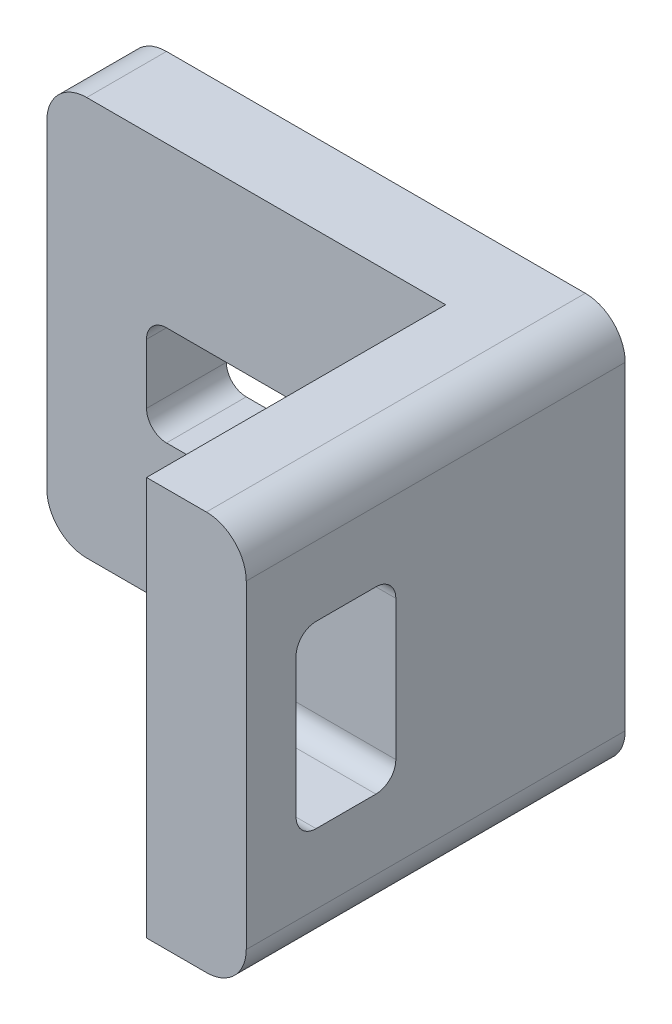
ISO-10303-21;
HEADER;
FILE_DESCRIPTION(('STEP AP214'),'2;1');
FILE_NAME('part.step','',(''),(''),'','','');
FILE_SCHEMA(('AUTOMOTIVE_DESIGN { 1 0 10303 214 1 1 1 1 }'));
ENDSEC;
DATA;
#1=APPLICATION_CONTEXT('core data for automotive mechanical design processes');
#2=APPLICATION_PROTOCOL_DEFINITION('international standard','automotive_design',2000,#1);
#3=PRODUCT_CONTEXT('',#1,'mechanical');
#4=PRODUCT('Part','Part','',(#3));
#5=PRODUCT_RELATED_PRODUCT_CATEGORY('part','',(#4));
#6=PRODUCT_DEFINITION_FORMATION('','',#4);
#7=PRODUCT_DEFINITION_CONTEXT('part definition',#1,'design');
#8=PRODUCT_DEFINITION('design','',#6,#7);
#9=PRODUCT_DEFINITION_SHAPE('','',#8);
#10=(LENGTH_UNIT() NAMED_UNIT(*) SI_UNIT(.MILLI.,.METRE.));
#11=(NAMED_UNIT(*) PLANE_ANGLE_UNIT() SI_UNIT($,.RADIAN.));
#12=(NAMED_UNIT(*) SI_UNIT($,.STERADIAN.) SOLID_ANGLE_UNIT());
#13=UNCERTAINTY_MEASURE_WITH_UNIT(LENGTH_MEASURE(1.E-05),#10,'distance_accuracy_value','');
#14=(GEOMETRIC_REPRESENTATION_CONTEXT(3) GLOBAL_UNCERTAINTY_ASSIGNED_CONTEXT((#13)) GLOBAL_UNIT_ASSIGNED_CONTEXT((#10,
#11,#12)) REPRESENTATION_CONTEXT('',''));
#15=CARTESIAN_POINT('',(0.,0.,0.));
#16=DIRECTION('',(0.,0.,1.));
#17=DIRECTION('',(1.,0.,0.));
#18=AXIS2_PLACEMENT_3D('',#15,#16,#17);
#19=CARTESIAN_POINT('',(9.72672672672673,6.70870870870871,4.));
#20=DIRECTION('',(0.,0.,-1.));
#21=DIRECTION('',(-1.,0.,0.));
#22=AXIS2_PLACEMENT_3D('',#19,#20,#21);
#23=PLANE('',#22);
#24=DIRECTION('',(0.,-1.,0.));
#25=VECTOR('',#24,1.);
#26=CARTESIAN_POINT('',(-8.27327327327327,-0.291291291291291,4.));
#27=LINE('',#26,#25);
#28=CARTESIAN_POINT('',(-8.27327327327327,-0.291291291291291,4.));
#29=VERTEX_POINT('',#28);
#30=CARTESIAN_POINT('',(-8.27327327327327,-3.29129129129129,4.));
#31=VERTEX_POINT('',#30);
#32=EDGE_CURVE('E277',#29,#31,#27,.T.);
#33=ORIENTED_EDGE('',*,*,#32,.F.);
#34=CARTESIAN_POINT('',(-7.27327327327327,-0.291291291291291,4.));
#35=DIRECTION('',(0.,0.,1.));
#36=DIRECTION('',(-1.,0.,0.));
#37=AXIS2_PLACEMENT_3D('',#34,#35,#36);
#38=CIRCLE('',#37,1.);
#39=CARTESIAN_POINT('',(-7.27327327327327,0.708708708708709,4.));
#40=VERTEX_POINT('',#39);
#41=EDGE_CURVE('E275',#40,#29,#38,.T.);
#42=ORIENTED_EDGE('',*,*,#41,.F.);
#43=DIRECTION('',(-1.,0.,0.));
#44=VECTOR('',#43,1.);
#45=CARTESIAN_POINT('',(-7.27327327327327,0.708708708708709,4.));
#46=LINE('',#45,#44);
#47=CARTESIAN_POINT('',(-0.273273273273275,0.708708708708709,4.));
#48=VERTEX_POINT('',#47);
#49=EDGE_CURVE('E295',#48,#40,#46,.T.);
#50=ORIENTED_EDGE('',*,*,#49,.F.);
#51=CARTESIAN_POINT('',(-0.273273273273275,-0.291291291291291,4.));
#52=DIRECTION('',(0.,0.,1.));
#53=DIRECTION('',(1.,0.,0.));
#54=AXIS2_PLACEMENT_3D('',#51,#52,#53);
#55=CIRCLE('',#54,1.);
#56=CARTESIAN_POINT('',(0.726726726726726,-0.291291291291291,4.));
#57=VERTEX_POINT('',#56);
#58=EDGE_CURVE('E292',#57,#48,#55,.T.);
#59=ORIENTED_EDGE('',*,*,#58,.F.);
#60=DIRECTION('',(0.,1.,0.));
#61=VECTOR('',#60,1.);
#62=CARTESIAN_POINT('',(0.726726726726726,-0.291291291291291,4.));
#63=LINE('',#62,#61);
#64=CARTESIAN_POINT('',(0.726726726726727,-3.29129129129129,4.));
#65=VERTEX_POINT('',#64);
#66=EDGE_CURVE('E289',#65,#57,#63,.T.);
#67=ORIENTED_EDGE('',*,*,#66,.F.);
#68=CARTESIAN_POINT('',(-0.273273273273274,-3.29129129129129,4.));
#69=DIRECTION('',(0.,0.,1.));
#70=DIRECTION('',(1.,0.,0.));
#71=AXIS2_PLACEMENT_3D('',#68,#69,#70);
#72=CIRCLE('',#71,1.);
#73=CARTESIAN_POINT('',(-0.273273273273274,-4.29129129129129,4.));
#74=VERTEX_POINT('',#73);
#75=EDGE_CURVE('E286',#74,#65,#72,.T.);
#76=ORIENTED_EDGE('',*,*,#75,.F.);
#77=DIRECTION('',(1.,0.,0.));
#78=VECTOR('',#77,1.);
#79=CARTESIAN_POINT('',(-7.27327327327327,-4.29129129129129,4.));
#80=LINE('',#79,#78);
#81=CARTESIAN_POINT('',(-7.27327327327327,-4.29129129129129,4.));
#82=VERTEX_POINT('',#81);
#83=EDGE_CURVE('E283',#82,#74,#80,.T.);
#84=ORIENTED_EDGE('',*,*,#83,.F.);
#85=CARTESIAN_POINT('',(-7.27327327327327,-3.29129129129129,4.));
#86=DIRECTION('',(0.,0.,1.));
#87=DIRECTION('',(1.,0.,0.));
#88=AXIS2_PLACEMENT_3D('',#85,#86,#87);
#89=CIRCLE('',#88,1.);
#90=EDGE_CURVE('E280',#31,#82,#89,.T.);
#91=ORIENTED_EDGE('',*,*,#90,.F.);
#92=EDGE_LOOP('',(#33,#42,#50,#59,#67,#76,#84,#91));
#93=FACE_BOUND('',#92,.T.);
#94=DIRECTION('',(0.,-1.,0.));
#95=VECTOR('',#94,1.);
#96=CARTESIAN_POINT('',(6.72672672672674,8.70870870870871,4.));
#97=LINE('',#96,#95);
#98=CARTESIAN_POINT('',(6.72672672672674,8.70870870870871,4.));
#99=VERTEX_POINT('',#98);
#100=CARTESIAN_POINT('',(6.72672672672674,-11.2912912912913,4.));
#101=VERTEX_POINT('',#100);
#102=EDGE_CURVE('E301',#99,#101,#97,.T.);
#103=ORIENTED_EDGE('',*,*,#102,.F.);
#104=DIRECTION('',(-1.,0.,0.));
#105=VECTOR('',#104,1.);
#106=CARTESIAN_POINT('',(-11.2732732732733,8.70870870870871,4.));
#107=LINE('',#106,#105);
#108=CARTESIAN_POINT('',(-11.2732732732733,8.70870870870871,4.));
#109=VERTEX_POINT('',#108);
#110=EDGE_CURVE('E342',#99,#109,#107,.T.);
#111=ORIENTED_EDGE('',*,*,#110,.T.);
#112=CARTESIAN_POINT('',(-11.2732732732733,6.70870870870871,4.));
#113=DIRECTION('',(0.,0.,1.));
#114=DIRECTION('',(-1.,0.,0.));
#115=AXIS2_PLACEMENT_3D('',#112,#113,#114);
#116=CIRCLE('',#115,2.);
#117=CARTESIAN_POINT('',(-13.2732732732733,6.7087087087087,4.));
#118=VERTEX_POINT('',#117);
#119=EDGE_CURVE('E344',#109,#118,#116,.T.);
#120=ORIENTED_EDGE('',*,*,#119,.T.);
#121=DIRECTION('',(0.,-1.,0.));
#122=VECTOR('',#121,1.);
#123=CARTESIAN_POINT('',(-13.2732732732733,6.7087087087087,4.));
#124=LINE('',#123,#122);
#125=CARTESIAN_POINT('',(-13.2732732732733,-9.29129129129128,4.));
#126=VERTEX_POINT('',#125);
#127=EDGE_CURVE('E347',#118,#126,#124,.T.);
#128=ORIENTED_EDGE('',*,*,#127,.T.);
#129=CARTESIAN_POINT('',(-11.2732732732733,-9.29129129129129,4.));
#130=DIRECTION('',(0.,0.,1.));
#131=DIRECTION('',(-1.,0.,0.));
#132=AXIS2_PLACEMENT_3D('',#129,#130,#131);
#133=CIRCLE('',#132,2.);
#134=CARTESIAN_POINT('',(-11.2732732732733,-11.2912912912913,4.));
#135=VERTEX_POINT('',#134);
#136=EDGE_CURVE('E349',#126,#135,#133,.T.);
#137=ORIENTED_EDGE('',*,*,#136,.T.);
#138=DIRECTION('',(1.,0.,0.));
#139=VECTOR('',#138,1.);
#140=CARTESIAN_POINT('',(-11.2732732732733,-11.2912912912913,4.));
#141=LINE('',#140,#139);
#142=EDGE_CURVE('E351',#135,#101,#141,.T.);
#143=ORIENTED_EDGE('',*,*,#142,.T.);
#144=EDGE_LOOP('',(#103,#111,#120,#128,#137,#143));
#145=FACE_BOUND('',#144,.T.);
#146=ADVANCED_FACE('F33',(#93,#145),#23,.F.);
#147=CARTESIAN_POINT('',(9.72672672672673,6.70870870870871,4.));
#148=DIRECTION('',(0.,0.,-1.));
#149=DIRECTION('',(-1.,0.,0.));
#150=AXIS2_PLACEMENT_3D('',#147,#148,#149);
#151=CYLINDRICAL_SURFACE('',#150,2.);
#152=CARTESIAN_POINT('',(9.72672672672673,6.70870870870871,0.));
#153=DIRECTION('',(0.,0.,1.));
#154=DIRECTION('',(-1.,0.,0.));
#155=AXIS2_PLACEMENT_3D('',#152,#153,#154);
#156=CIRCLE('',#155,2.);
#157=CARTESIAN_POINT('',(11.7267267267267,6.70870870870871,0.));
#158=VERTEX_POINT('',#157);
#159=CARTESIAN_POINT('',(9.72672672672673,8.70870870870871,0.));
#160=VERTEX_POINT('',#159);
#161=EDGE_CURVE('E341',#158,#160,#156,.T.);
#162=ORIENTED_EDGE('',*,*,#161,.T.);
#163=DIRECTION('',(0.,0.,-1.));
#164=VECTOR('',#163,1.);
#165=CARTESIAN_POINT('',(9.72672672672673,8.70870870870871,4.));
#166=LINE('',#165,#164);
#167=CARTESIAN_POINT('',(9.72672672672673,8.70870870870871,19.));
#168=VERTEX_POINT('',#167);
#169=EDGE_CURVE('E389',#168,#160,#166,.T.);
#170=ORIENTED_EDGE('',*,*,#169,.F.);
#171=CARTESIAN_POINT('',(9.72672672672673,6.70870870870871,19.));
#172=DIRECTION('',(0.,0.,1.));
#173=DIRECTION('',(-1.,0.,0.));
#174=AXIS2_PLACEMENT_3D('',#171,#172,#173);
#175=CIRCLE('',#174,2.);
#176=CARTESIAN_POINT('',(11.7267267267267,6.70870870870871,19.));
#177=VERTEX_POINT('',#176);
#178=EDGE_CURVE('E328',#177,#168,#175,.T.);
#179=ORIENTED_EDGE('',*,*,#178,.F.);
#180=DIRECTION('',(0.,0.,-1.));
#181=VECTOR('',#180,1.);
#182=CARTESIAN_POINT('',(11.7267267267267,6.70870870870871,4.));
#183=LINE('',#182,#181);
#184=EDGE_CURVE('E353',#177,#158,#183,.T.);
#185=ORIENTED_EDGE('',*,*,#184,.T.);
#186=EDGE_LOOP('',(#162,#170,#179,#185));
#187=FACE_BOUND('',#186,.T.);
#188=ADVANCED_FACE('F35',(#187),#151,.T.);
#189=CARTESIAN_POINT('',(-11.2732732732733,8.70870870870871,4.));
#190=DIRECTION('',(0.,-1.,0.));
#191=DIRECTION('',(0.,0.,-1.));
#192=AXIS2_PLACEMENT_3D('',#189,#190,#191);
#193=PLANE('',#192);
#194=DIRECTION('',(-1.,0.,0.));
#195=VECTOR('',#194,1.);
#196=CARTESIAN_POINT('',(-11.2732732732733,8.70870870870871,0.));
#197=LINE('',#196,#195);
#198=CARTESIAN_POINT('',(-11.2732732732733,8.70870870870871,0.));
#199=VERTEX_POINT('',#198);
#200=EDGE_CURVE('E356',#160,#199,#197,.T.);
#201=ORIENTED_EDGE('',*,*,#200,.T.);
#202=DIRECTION('',(0.,0.,-1.));
#203=VECTOR('',#202,1.);
#204=CARTESIAN_POINT('',(-11.2732732732733,8.70870870870871,4.));
#205=LINE('',#204,#203);
#206=EDGE_CURVE('E386',#109,#199,#205,.T.);
#207=ORIENTED_EDGE('',*,*,#206,.F.);
#208=ORIENTED_EDGE('',*,*,#110,.F.);
#209=DIRECTION('',(0.,0.,-1.));
#210=VECTOR('',#209,1.);
#211=CARTESIAN_POINT('',(6.72672672672674,8.70870870870871,19.));
#212=LINE('',#211,#210);
#213=CARTESIAN_POINT('',(6.72672672672674,8.70870870870871,19.));
#214=VERTEX_POINT('',#213);
#215=EDGE_CURVE('E333',#214,#99,#212,.T.);
#216=ORIENTED_EDGE('',*,*,#215,.F.);
#217=DIRECTION('',(-1.,0.,0.));
#218=VECTOR('',#217,1.);
#219=CARTESIAN_POINT('',(6.72672672672674,8.70870870870871,19.));
#220=LINE('',#219,#218);
#221=EDGE_CURVE('E331',#168,#214,#220,.T.);
#222=ORIENTED_EDGE('',*,*,#221,.F.);
#223=ORIENTED_EDGE('',*,*,#169,.T.);
#224=EDGE_LOOP('',(#201,#207,#208,#216,#222,#223));
#225=FACE_BOUND('',#224,.T.);
#226=ADVANCED_FACE('F461',(#225),#193,.F.);
#227=CARTESIAN_POINT('',(-11.2732732732733,6.70870870870871,4.));
#228=DIRECTION('',(0.,0.,-1.));
#229=DIRECTION('',(-1.,0.,0.));
#230=AXIS2_PLACEMENT_3D('',#227,#228,#229);
#231=CYLINDRICAL_SURFACE('',#230,2.);
#232=CARTESIAN_POINT('',(-11.2732732732733,6.70870870870871,0.));
#233=DIRECTION('',(0.,0.,1.));
#234=DIRECTION('',(-1.,0.,0.));
#235=AXIS2_PLACEMENT_3D('',#232,#233,#234);
#236=CIRCLE('',#235,2.);
#237=CARTESIAN_POINT('',(-13.2732732732733,6.7087087087087,0.));
#238=VERTEX_POINT('',#237);
#239=EDGE_CURVE('E358',#199,#238,#236,.T.);
#240=ORIENTED_EDGE('',*,*,#239,.T.);
#241=DIRECTION('',(0.,0.,-1.));
#242=VECTOR('',#241,1.);
#243=CARTESIAN_POINT('',(-13.2732732732733,6.7087087087087,4.));
#244=LINE('',#243,#242);
#245=EDGE_CURVE('E383',#118,#238,#244,.T.);
#246=ORIENTED_EDGE('',*,*,#245,.F.);
#247=ORIENTED_EDGE('',*,*,#119,.F.);
#248=ORIENTED_EDGE('',*,*,#206,.T.);
#249=EDGE_LOOP('',(#240,#246,#247,#248));
#250=FACE_BOUND('',#249,.T.);
#251=ADVANCED_FACE('F487',(#250),#231,.T.);
#252=CARTESIAN_POINT('',(-13.2732732732733,6.7087087087087,4.));
#253=DIRECTION('',(1.,0.,0.));
#254=DIRECTION('',(0.,0.,-1.));
#255=AXIS2_PLACEMENT_3D('',#252,#253,#254);
#256=PLANE('',#255);
#257=DIRECTION('',(0.,-1.,0.));
#258=VECTOR('',#257,1.);
#259=CARTESIAN_POINT('',(-13.2732732732733,6.7087087087087,0.));
#260=LINE('',#259,#258);
#261=CARTESIAN_POINT('',(-13.2732732732733,-9.29129129129128,0.));
#262=VERTEX_POINT('',#261);
#263=EDGE_CURVE('E360',#238,#262,#260,.T.);
#264=ORIENTED_EDGE('',*,*,#263,.T.);
#265=DIRECTION('',(0.,0.,-1.));
#266=VECTOR('',#265,1.);
#267=CARTESIAN_POINT('',(-13.2732732732733,-9.29129129129128,4.));
#268=LINE('',#267,#266);
#269=EDGE_CURVE('E380',#126,#262,#268,.T.);
#270=ORIENTED_EDGE('',*,*,#269,.F.);
#271=ORIENTED_EDGE('',*,*,#127,.F.);
#272=ORIENTED_EDGE('',*,*,#245,.T.);
#273=EDGE_LOOP('',(#264,#270,#271,#272));
#274=FACE_BOUND('',#273,.T.);
#275=ADVANCED_FACE('F483',(#274),#256,.F.);
#276=CARTESIAN_POINT('',(-11.2732732732733,-9.29129129129129,4.));
#277=DIRECTION('',(0.,0.,-1.));
#278=DIRECTION('',(-1.,0.,0.));
#279=AXIS2_PLACEMENT_3D('',#276,#277,#278);
#280=CYLINDRICAL_SURFACE('',#279,2.);
#281=CARTESIAN_POINT('',(-11.2732732732733,-9.29129129129129,0.));
#282=DIRECTION('',(0.,0.,1.));
#283=DIRECTION('',(-1.,0.,0.));
#284=AXIS2_PLACEMENT_3D('',#281,#282,#283);
#285=CIRCLE('',#284,2.);
#286=CARTESIAN_POINT('',(-11.2732732732733,-11.2912912912913,0.));
#287=VERTEX_POINT('',#286);
#288=EDGE_CURVE('E362',#262,#287,#285,.T.);
#289=ORIENTED_EDGE('',*,*,#288,.T.);
#290=DIRECTION('',(0.,0.,-1.));
#291=VECTOR('',#290,1.);
#292=CARTESIAN_POINT('',(-11.2732732732733,-11.2912912912913,4.));
#293=LINE('',#292,#291);
#294=EDGE_CURVE('E377',#135,#287,#293,.T.);
#295=ORIENTED_EDGE('',*,*,#294,.F.);
#296=ORIENTED_EDGE('',*,*,#136,.F.);
#297=ORIENTED_EDGE('',*,*,#269,.T.);
#298=EDGE_LOOP('',(#289,#295,#296,#297));
#299=FACE_BOUND('',#298,.T.);
#300=ADVANCED_FACE('F479',(#299),#280,.T.);
#301=CARTESIAN_POINT('',(-11.2732732732733,-11.2912912912913,4.));
#302=DIRECTION('',(0.,1.,0.));
#303=DIRECTION('',(0.,0.,1.));
#304=AXIS2_PLACEMENT_3D('',#301,#302,#303);
#305=PLANE('',#304);
#306=DIRECTION('',(1.,0.,0.));
#307=VECTOR('',#306,1.);
#308=CARTESIAN_POINT('',(-11.2732732732733,-11.2912912912913,0.));
#309=LINE('',#308,#307);
#310=CARTESIAN_POINT('',(9.72672672672673,-11.2912912912913,0.));
#311=VERTEX_POINT('',#310);
#312=EDGE_CURVE('E364',#287,#311,#309,.T.);
#313=ORIENTED_EDGE('',*,*,#312,.T.);
#314=DIRECTION('',(0.,0.,-1.));
#315=VECTOR('',#314,1.);
#316=CARTESIAN_POINT('',(9.72672672672673,-11.2912912912913,4.));
#317=LINE('',#316,#315);
#318=CARTESIAN_POINT('',(9.72672672672673,-11.2912912912913,19.));
#319=VERTEX_POINT('',#318);
#320=EDGE_CURVE('E374',#319,#311,#317,.T.);
#321=ORIENTED_EDGE('',*,*,#320,.F.);
#322=DIRECTION('',(1.,0.,0.));
#323=VECTOR('',#322,1.);
#324=CARTESIAN_POINT('',(6.72672672672674,-11.2912912912913,19.));
#325=LINE('',#324,#323);
#326=CARTESIAN_POINT('',(6.72672672672674,-11.2912912912913,19.));
#327=VERTEX_POINT('',#326);
#328=EDGE_CURVE('E319',#327,#319,#325,.T.);
#329=ORIENTED_EDGE('',*,*,#328,.F.);
#330=DIRECTION('',(0.,0.,-1.));
#331=VECTOR('',#330,1.);
#332=CARTESIAN_POINT('',(6.72672672672674,-11.2912912912913,19.));
#333=LINE('',#332,#331);
#334=EDGE_CURVE('E338',#327,#101,#333,.T.);
#335=ORIENTED_EDGE('',*,*,#334,.T.);
#336=ORIENTED_EDGE('',*,*,#142,.F.);
#337=ORIENTED_EDGE('',*,*,#294,.T.);
#338=EDGE_LOOP('',(#313,#321,#329,#335,#336,#337));
#339=FACE_BOUND('',#338,.T.);
#340=ADVANCED_FACE('F475',(#339),#305,.F.);
#341=CARTESIAN_POINT('',(9.72672672672673,-9.29129129129129,4.));
#342=DIRECTION('',(0.,0.,-1.));
#343=DIRECTION('',(-1.,0.,0.));
#344=AXIS2_PLACEMENT_3D('',#341,#342,#343);
#345=CYLINDRICAL_SURFACE('',#344,2.);
#346=CARTESIAN_POINT('',(9.72672672672673,-9.29129129129129,0.));
#347=DIRECTION('',(0.,0.,1.));
#348=DIRECTION('',(-1.,0.,0.));
#349=AXIS2_PLACEMENT_3D('',#346,#347,#348);
#350=CIRCLE('',#349,2.);
#351=CARTESIAN_POINT('',(11.7267267267267,-9.29129129129129,0.));
#352=VERTEX_POINT('',#351);
#353=EDGE_CURVE('E366',#311,#352,#350,.T.);
#354=ORIENTED_EDGE('',*,*,#353,.T.);
#355=DIRECTION('',(0.,0.,-1.));
#356=VECTOR('',#355,1.);
#357=CARTESIAN_POINT('',(11.7267267267267,-9.29129129129129,4.));
#358=LINE('',#357,#356);
#359=CARTESIAN_POINT('',(11.7267267267267,-9.29129129129129,19.));
#360=VERTEX_POINT('',#359);
#361=EDGE_CURVE('E371',#360,#352,#358,.T.);
#362=ORIENTED_EDGE('',*,*,#361,.F.);
#363=CARTESIAN_POINT('',(9.72672672672673,-9.29129129129129,19.));
#364=DIRECTION('',(0.,0.,1.));
#365=DIRECTION('',(-1.,0.,0.));
#366=AXIS2_PLACEMENT_3D('',#363,#364,#365);
#367=CIRCLE('',#366,2.);
#368=EDGE_CURVE('E322',#319,#360,#367,.T.);
#369=ORIENTED_EDGE('',*,*,#368,.F.);
#370=ORIENTED_EDGE('',*,*,#320,.T.);
#371=EDGE_LOOP('',(#354,#362,#369,#370));
#372=FACE_BOUND('',#371,.T.);
#373=ADVANCED_FACE('F471',(#372),#345,.T.);
#374=CARTESIAN_POINT('',(11.7267267267267,6.70870870870871,4.));
#375=DIRECTION('',(-1.,0.,0.));
#376=DIRECTION('',(0.,-1.,0.));
#377=AXIS2_PLACEMENT_3D('',#374,#375,#376);
#378=PLANE('',#377);
#379=DIRECTION('',(0.,0.,-1.));
#380=VECTOR('',#379,1.);
#381=CARTESIAN_POINT('',(11.7267267267267,3.20870870870871,4.));
#382=LINE('',#381,#380);
#383=CARTESIAN_POINT('',(11.7267267267267,3.20870870870871,15.5));
#384=VERTEX_POINT('',#383);
#385=CARTESIAN_POINT('',(11.7267267267267,3.20870870870871,12.5));
#386=VERTEX_POINT('',#385);
#387=EDGE_CURVE('E269',#384,#386,#382,.T.);
#388=ORIENTED_EDGE('',*,*,#387,.T.);
#389=CARTESIAN_POINT('',(11.7267267267267,2.20870870870871,12.5));
#390=DIRECTION('',(-1.,0.,0.));
#391=DIRECTION('',(0.,-1.,0.));
#392=AXIS2_PLACEMENT_3D('',#389,#390,#391);
#393=CIRCLE('',#392,0.999999999999997);
#394=CARTESIAN_POINT('',(11.7267267267267,2.20870870870871,11.5));
#395=VERTEX_POINT('',#394);
#396=EDGE_CURVE('E272',#386,#395,#393,.T.);
#397=ORIENTED_EDGE('',*,*,#396,.T.);
#398=DIRECTION('',(0.,-1.,0.));
#399=VECTOR('',#398,1.);
#400=CARTESIAN_POINT('',(11.7267267267267,6.70870870870871,11.5));
#401=LINE('',#400,#399);
#402=CARTESIAN_POINT('',(11.7267267267267,-4.79129129129129,11.5));
#403=VERTEX_POINT('',#402);
#404=EDGE_CURVE('E244',#395,#403,#401,.T.);
#405=ORIENTED_EDGE('',*,*,#404,.T.);
#406=CARTESIAN_POINT('',(11.7267267267267,-4.79129129129129,12.5));
#407=DIRECTION('',(-1.,0.,0.));
#408=DIRECTION('',(0.,-1.,0.));
#409=AXIS2_PLACEMENT_3D('',#406,#407,#408);
#410=CIRCLE('',#409,0.999999999999998);
#411=CARTESIAN_POINT('',(11.7267267267267,-5.79129129129129,12.5));
#412=VERTEX_POINT('',#411);
#413=EDGE_CURVE('E211',#403,#412,#410,.T.);
#414=ORIENTED_EDGE('',*,*,#413,.T.);
#415=DIRECTION('',(0.,0.,1.));
#416=VECTOR('',#415,1.);
#417=CARTESIAN_POINT('',(11.7267267267267,-5.79129129129129,4.));
#418=LINE('',#417,#416);
#419=CARTESIAN_POINT('',(11.7267267267267,-5.79129129129129,15.5));
#420=VERTEX_POINT('',#419);
#421=EDGE_CURVE('E257',#412,#420,#418,.T.);
#422=ORIENTED_EDGE('',*,*,#421,.T.);
#423=CARTESIAN_POINT('',(11.7267267267267,-4.79129129129129,15.5));
#424=DIRECTION('',(-1.,0.,0.));
#425=DIRECTION('',(0.,-1.,0.));
#426=AXIS2_PLACEMENT_3D('',#423,#424,#425);
#427=CIRCLE('',#426,0.999999999999997);
#428=CARTESIAN_POINT('',(11.7267267267267,-4.79129129129129,16.5));
#429=VERTEX_POINT('',#428);
#430=EDGE_CURVE('E260',#420,#429,#427,.T.);
#431=ORIENTED_EDGE('',*,*,#430,.T.);
#432=DIRECTION('',(0.,1.,0.));
#433=VECTOR('',#432,1.);
#434=CARTESIAN_POINT('',(11.7267267267267,6.70870870870871,16.5));
#435=LINE('',#434,#433);
#436=CARTESIAN_POINT('',(11.7267267267267,2.20870870870871,16.5));
#437=VERTEX_POINT('',#436);
#438=EDGE_CURVE('E263',#429,#437,#435,.T.);
#439=ORIENTED_EDGE('',*,*,#438,.T.);
#440=CARTESIAN_POINT('',(11.7267267267267,2.20870870870871,15.5));
#441=DIRECTION('',(-1.,0.,0.));
#442=DIRECTION('',(0.,-1.,0.));
#443=AXIS2_PLACEMENT_3D('',#440,#441,#442);
#444=CIRCLE('',#443,0.999999999999998);
#445=EDGE_CURVE('E266',#437,#384,#444,.T.);
#446=ORIENTED_EDGE('',*,*,#445,.T.);
#447=EDGE_LOOP('',(#388,#397,#405,#414,#422,#431,#439,#446));
#448=FACE_BOUND('',#447,.T.);
#449=DIRECTION('',(0.,1.,0.));
#450=VECTOR('',#449,1.);
#451=CARTESIAN_POINT('',(11.7267267267267,6.70870870870871,0.));
#452=LINE('',#451,#450);
#453=EDGE_CURVE('E345',#352,#158,#452,.T.);
#454=ORIENTED_EDGE('',*,*,#453,.T.);
#455=ORIENTED_EDGE('',*,*,#184,.F.);
#456=DIRECTION('',(0.,1.,0.));
#457=VECTOR('',#456,1.);
#458=CARTESIAN_POINT('',(11.7267267267267,6.70870870870871,19.));
#459=LINE('',#458,#457);
#460=EDGE_CURVE('E325',#360,#177,#459,.T.);
#461=ORIENTED_EDGE('',*,*,#460,.F.);
#462=ORIENTED_EDGE('',*,*,#361,.T.);
#463=EDGE_LOOP('',(#454,#455,#461,#462));
#464=FACE_BOUND('',#463,.T.);
#465=ADVANCED_FACE('F468',(#448,#464),#378,.F.);
#466=CARTESIAN_POINT('',(9.72672672672673,6.70870870870871,0.));
#467=DIRECTION('',(0.,0.,-1.));
#468=DIRECTION('',(-1.,0.,0.));
#469=AXIS2_PLACEMENT_3D('',#466,#467,#468);
#470=PLANE('',#469);
#471=CARTESIAN_POINT('',(-7.27327327327327,-0.291291291291291,0.));
#472=DIRECTION('',(0.,0.,-1.));
#473=DIRECTION('',(-1.,0.,0.));
#474=AXIS2_PLACEMENT_3D('',#471,#472,#473);
#475=CIRCLE('',#474,1.);
#476=CARTESIAN_POINT('',(-8.27327327327327,-0.291291291291291,0.));
#477=VERTEX_POINT('',#476);
#478=CARTESIAN_POINT('',(-7.27327327327327,0.708708708708709,0.));
#479=VERTEX_POINT('',#478);
#480=EDGE_CURVE('E11',#477,#479,#475,.T.);
#481=ORIENTED_EDGE('',*,*,#480,.F.);
#482=DIRECTION('',(0.,1.,0.));
#483=VECTOR('',#482,1.);
#484=CARTESIAN_POINT('',(-8.27327327327327,6.70870870870871,0.));
#485=LINE('',#484,#483);
#486=CARTESIAN_POINT('',(-8.27327327327327,-3.29129129129129,0.));
#487=VERTEX_POINT('',#486);
#488=EDGE_CURVE('E392',#487,#477,#485,.T.);
#489=ORIENTED_EDGE('',*,*,#488,.F.);
#490=CARTESIAN_POINT('',(-7.27327327327327,-3.29129129129129,0.));
#491=DIRECTION('',(0.,0.,-1.));
#492=DIRECTION('',(-1.,0.,0.));
#493=AXIS2_PLACEMENT_3D('',#490,#491,#492);
#494=CIRCLE('',#493,1.);
#495=CARTESIAN_POINT('',(-7.27327327327327,-4.29129129129129,0.));
#496=VERTEX_POINT('',#495);
#497=EDGE_CURVE('E394',#496,#487,#494,.T.);
#498=ORIENTED_EDGE('',*,*,#497,.F.);
#499=DIRECTION('',(-1.,0.,0.));
#500=VECTOR('',#499,1.);
#501=CARTESIAN_POINT('',(9.72672672672673,-4.29129129129129,0.));
#502=LINE('',#501,#500);
#503=CARTESIAN_POINT('',(-0.273273273273274,-4.29129129129129,0.));
#504=VERTEX_POINT('',#503);
#505=EDGE_CURVE('E397',#504,#496,#502,.T.);
#506=ORIENTED_EDGE('',*,*,#505,.F.);
#507=CARTESIAN_POINT('',(-0.273273273273274,-3.29129129129129,0.));
#508=DIRECTION('',(0.,0.,-1.));
#509=DIRECTION('',(-1.,0.,0.));
#510=AXIS2_PLACEMENT_3D('',#507,#508,#509);
#511=CIRCLE('',#510,1.);
#512=CARTESIAN_POINT('',(0.726726726726727,-3.29129129129129,0.));
#513=VERTEX_POINT('',#512);
#514=EDGE_CURVE('E399',#513,#504,#511,.T.);
#515=ORIENTED_EDGE('',*,*,#514,.F.);
#516=DIRECTION('',(0.,-1.,0.));
#517=VECTOR('',#516,1.);
#518=CARTESIAN_POINT('',(0.726726726726724,6.70870870870871,0.));
#519=LINE('',#518,#517);
#520=CARTESIAN_POINT('',(0.726726726726726,-0.291291291291291,0.));
#521=VERTEX_POINT('',#520);
#522=EDGE_CURVE('E401',#521,#513,#519,.T.);
#523=ORIENTED_EDGE('',*,*,#522,.F.);
#524=CARTESIAN_POINT('',(-0.273273273273275,-0.291291291291291,0.));
#525=DIRECTION('',(0.,0.,-1.));
#526=DIRECTION('',(-1.,0.,0.));
#527=AXIS2_PLACEMENT_3D('',#524,#525,#526);
#528=CIRCLE('',#527,1.);
#529=CARTESIAN_POINT('',(-0.273273273273275,0.708708708708709,0.));
#530=VERTEX_POINT('',#529);
#531=EDGE_CURVE('E403',#530,#521,#528,.T.);
#532=ORIENTED_EDGE('',*,*,#531,.F.);
#533=DIRECTION('',(1.,0.,0.));
#534=VECTOR('',#533,1.);
#535=CARTESIAN_POINT('',(9.72672672672673,0.708708708708709,0.));
#536=LINE('',#535,#534);
#537=EDGE_CURVE('E41',#479,#530,#536,.T.);
#538=ORIENTED_EDGE('',*,*,#537,.F.);
#539=EDGE_LOOP('',(#481,#489,#498,#506,#515,#523,#532,#538));
#540=FACE_BOUND('',#539,.T.);
#541=ORIENTED_EDGE('',*,*,#161,.F.);
#542=ORIENTED_EDGE('',*,*,#453,.F.);
#543=ORIENTED_EDGE('',*,*,#353,.F.);
#544=ORIENTED_EDGE('',*,*,#312,.F.);
#545=ORIENTED_EDGE('',*,*,#288,.F.);
#546=ORIENTED_EDGE('',*,*,#263,.F.);
#547=ORIENTED_EDGE('',*,*,#239,.F.);
#548=ORIENTED_EDGE('',*,*,#200,.F.);
#549=EDGE_LOOP('',(#541,#542,#543,#544,#545,#546,#547,#548));
#550=FACE_BOUND('',#549,.T.);
#551=ADVANCED_FACE('F418',(#540,#550),#470,.T.);
#552=CARTESIAN_POINT('',(6.72672672672674,8.70870870870871,19.));
#553=DIRECTION('',(1.,0.,0.));
#554=DIRECTION('',(0.,0.,-1.));
#555=AXIS2_PLACEMENT_3D('',#552,#553,#554);
#556=PLANE('',#555);
#557=DIRECTION('',(0.,-1.,0.));
#558=VECTOR('',#557,1.);
#559=CARTESIAN_POINT('',(6.72672672672674,2.20870870870871,11.5));
#560=LINE('',#559,#558);
#561=CARTESIAN_POINT('',(6.72672672672674,2.20870870870871,11.5));
#562=VERTEX_POINT('',#561);
#563=CARTESIAN_POINT('',(6.72672672672674,-4.79129129129129,11.5));
#564=VERTEX_POINT('',#563);
#565=EDGE_CURVE('E217',#562,#564,#560,.T.);
#566=ORIENTED_EDGE('',*,*,#565,.F.);
#567=CARTESIAN_POINT('',(6.72672672672674,2.20870870870871,12.5));
#568=DIRECTION('',(-1.,0.,0.));
#569=DIRECTION('',(0.,0.,-1.));
#570=AXIS2_PLACEMENT_3D('',#567,#568,#569);
#571=CIRCLE('',#570,0.999999999999997);
#572=CARTESIAN_POINT('',(6.72672672672674,3.20870870870871,12.5));
#573=VERTEX_POINT('',#572);
#574=EDGE_CURVE('E56',#573,#562,#571,.T.);
#575=ORIENTED_EDGE('',*,*,#574,.F.);
#576=DIRECTION('',(0.,0.,-1.));
#577=VECTOR('',#576,1.);
#578=CARTESIAN_POINT('',(6.72672672672674,3.20870870870871,12.5));
#579=LINE('',#578,#577);
#580=CARTESIAN_POINT('',(6.72672672672674,3.20870870870871,15.5));
#581=VERTEX_POINT('',#580);
#582=EDGE_CURVE('E239',#581,#573,#579,.T.);
#583=ORIENTED_EDGE('',*,*,#582,.F.);
#584=CARTESIAN_POINT('',(6.72672672672674,2.20870870870871,15.5));
#585=DIRECTION('',(-1.,0.,0.));
#586=DIRECTION('',(0.,0.,1.));
#587=AXIS2_PLACEMENT_3D('',#584,#585,#586);
#588=CIRCLE('',#587,0.999999999999998);
#589=CARTESIAN_POINT('',(6.72672672672674,2.20870870870871,16.5));
#590=VERTEX_POINT('',#589);
#591=EDGE_CURVE('E236',#590,#581,#588,.T.);
#592=ORIENTED_EDGE('',*,*,#591,.F.);
#593=DIRECTION('',(0.,1.,0.));
#594=VECTOR('',#593,1.);
#595=CARTESIAN_POINT('',(6.72672672672674,2.20870870870871,16.5));
#596=LINE('',#595,#594);
#597=CARTESIAN_POINT('',(6.72672672672674,-4.79129129129129,16.5));
#598=VERTEX_POINT('',#597);
#599=EDGE_CURVE('E233',#598,#590,#596,.T.);
#600=ORIENTED_EDGE('',*,*,#599,.F.);
#601=CARTESIAN_POINT('',(6.72672672672674,-4.79129129129129,15.5));
#602=DIRECTION('',(-1.,0.,0.));
#603=DIRECTION('',(0.,0.,1.));
#604=AXIS2_PLACEMENT_3D('',#601,#602,#603);
#605=CIRCLE('',#604,0.999999999999997);
#606=CARTESIAN_POINT('',(6.72672672672674,-5.79129129129129,15.5));
#607=VERTEX_POINT('',#606);
#608=EDGE_CURVE('E227',#607,#598,#605,.T.);
#609=ORIENTED_EDGE('',*,*,#608,.F.);
#610=DIRECTION('',(0.,0.,1.));
#611=VECTOR('',#610,1.);
#612=CARTESIAN_POINT('',(6.72672672672674,-5.79129129129129,12.5));
#613=LINE('',#612,#611);
#614=CARTESIAN_POINT('',(6.72672672672674,-5.79129129129129,12.5));
#615=VERTEX_POINT('',#614);
#616=EDGE_CURVE('E225',#615,#607,#613,.T.);
#617=ORIENTED_EDGE('',*,*,#616,.F.);
#618=CARTESIAN_POINT('',(6.72672672672674,-4.79129129129129,12.5));
#619=DIRECTION('',(-1.,0.,0.));
#620=DIRECTION('',(0.,0.,1.));
#621=AXIS2_PLACEMENT_3D('',#618,#619,#620);
#622=CIRCLE('',#621,0.999999999999998);
#623=EDGE_CURVE('E208',#564,#615,#622,.T.);
#624=ORIENTED_EDGE('',*,*,#623,.F.);
#625=EDGE_LOOP('',(#566,#575,#583,#592,#600,#609,#617,#624));
#626=FACE_BOUND('',#625,.T.);
#627=ORIENTED_EDGE('',*,*,#102,.T.);
#628=ORIENTED_EDGE('',*,*,#334,.F.);
#629=DIRECTION('',(0.,-1.,0.));
#630=VECTOR('',#629,1.);
#631=CARTESIAN_POINT('',(6.72672672672674,8.70870870870871,19.));
#632=LINE('',#631,#630);
#633=EDGE_CURVE('E316',#214,#327,#632,.T.);
#634=ORIENTED_EDGE('',*,*,#633,.F.);
#635=ORIENTED_EDGE('',*,*,#215,.T.);
#636=EDGE_LOOP('',(#627,#628,#634,#635));
#637=FACE_BOUND('',#636,.T.);
#638=ADVANCED_FACE('F221',(#626,#637),#556,.F.);
#639=CARTESIAN_POINT('',(9.72672672672673,-9.29129129129129,19.));
#640=DIRECTION('',(0.,0.,-1.));
#641=DIRECTION('',(-1.,0.,0.));
#642=AXIS2_PLACEMENT_3D('',#639,#640,#641);
#643=PLANE('',#642);
#644=ORIENTED_EDGE('',*,*,#633,.T.);
#645=ORIENTED_EDGE('',*,*,#328,.T.);
#646=ORIENTED_EDGE('',*,*,#368,.T.);
#647=ORIENTED_EDGE('',*,*,#460,.T.);
#648=ORIENTED_EDGE('',*,*,#178,.T.);
#649=ORIENTED_EDGE('',*,*,#221,.T.);
#650=EDGE_LOOP('',(#644,#645,#646,#647,#648,#649));
#651=FACE_BOUND('',#650,.T.);
#652=ADVANCED_FACE('F514',(#651),#643,.F.);
#653=CARTESIAN_POINT('',(-7.27327327327327,-0.291291291291291,-46.));
#654=DIRECTION('',(0.,0.,1.));
#655=DIRECTION('',(1.,0.,0.));
#656=AXIS2_PLACEMENT_3D('',#653,#654,#655);
#657=CYLINDRICAL_SURFACE('',#656,1.);
#658=ORIENTED_EDGE('',*,*,#480,.T.);
#659=DIRECTION('',(0.,0.,1.));
#660=VECTOR('',#659,1.);
#661=CARTESIAN_POINT('',(-7.27327327327327,0.708708708708709,-46.));
#662=LINE('',#661,#660);
#663=EDGE_CURVE('E299',#479,#40,#662,.T.);
#664=ORIENTED_EDGE('',*,*,#663,.T.);
#665=ORIENTED_EDGE('',*,*,#41,.T.);
#666=DIRECTION('',(0.,0.,1.));
#667=VECTOR('',#666,1.);
#668=CARTESIAN_POINT('',(-8.27327327327327,-0.291291291291291,-46.));
#669=LINE('',#668,#667);
#670=EDGE_CURVE('E298',#477,#29,#669,.T.);
#671=ORIENTED_EDGE('',*,*,#670,.F.);
#672=EDGE_LOOP('',(#658,#664,#665,#671));
#673=FACE_BOUND('',#672,.T.);
#674=ADVANCED_FACE('F438',(#673),#657,.F.);
#675=CARTESIAN_POINT('',(-7.27327327327327,0.708708708708709,-46.));
#676=DIRECTION('',(0.,1.,0.));
#677=DIRECTION('',(0.,0.,1.));
#678=AXIS2_PLACEMENT_3D('',#675,#676,#677);
#679=PLANE('',#678);
#680=ORIENTED_EDGE('',*,*,#537,.T.);
#681=DIRECTION('',(0.,0.,1.));
#682=VECTOR('',#681,1.);
#683=CARTESIAN_POINT('',(-0.273273273273275,0.708708708708709,-46.));
#684=LINE('',#683,#682);
#685=EDGE_CURVE('E302',#530,#48,#684,.T.);
#686=ORIENTED_EDGE('',*,*,#685,.T.);
#687=ORIENTED_EDGE('',*,*,#49,.T.);
#688=ORIENTED_EDGE('',*,*,#663,.F.);
#689=EDGE_LOOP('',(#680,#686,#687,#688));
#690=FACE_BOUND('',#689,.T.);
#691=ADVANCED_FACE('F408',(#690),#679,.F.);
#692=CARTESIAN_POINT('',(-0.273273273273275,-0.291291291291291,-46.));
#693=DIRECTION('',(0.,0.,1.));
#694=DIRECTION('',(1.,0.,0.));
#695=AXIS2_PLACEMENT_3D('',#692,#693,#694);
#696=CYLINDRICAL_SURFACE('',#695,1.);
#697=ORIENTED_EDGE('',*,*,#531,.T.);
#698=DIRECTION('',(0.,0.,1.));
#699=VECTOR('',#698,1.);
#700=CARTESIAN_POINT('',(0.726726726726726,-0.291291291291291,-46.));
#701=LINE('',#700,#699);
#702=EDGE_CURVE('E304',#521,#57,#701,.T.);
#703=ORIENTED_EDGE('',*,*,#702,.T.);
#704=ORIENTED_EDGE('',*,*,#58,.T.);
#705=ORIENTED_EDGE('',*,*,#685,.F.);
#706=EDGE_LOOP('',(#697,#703,#704,#705));
#707=FACE_BOUND('',#706,.T.);
#708=ADVANCED_FACE('F413',(#707),#696,.F.);
#709=CARTESIAN_POINT('',(0.726726726726726,-0.291291291291291,-46.));
#710=DIRECTION('',(1.,0.,0.));
#711=DIRECTION('',(0.,1.,0.));
#712=AXIS2_PLACEMENT_3D('',#709,#710,#711);
#713=PLANE('',#712);
#714=ORIENTED_EDGE('',*,*,#522,.T.);
#715=DIRECTION('',(0.,0.,1.));
#716=VECTOR('',#715,1.);
#717=CARTESIAN_POINT('',(0.726726726726727,-3.29129129129129,-46.));
#718=LINE('',#717,#716);
#719=EDGE_CURVE('E306',#513,#65,#718,.T.);
#720=ORIENTED_EDGE('',*,*,#719,.T.);
#721=ORIENTED_EDGE('',*,*,#66,.T.);
#722=ORIENTED_EDGE('',*,*,#702,.F.);
#723=EDGE_LOOP('',(#714,#720,#721,#722));
#724=FACE_BOUND('',#723,.T.);
#725=ADVANCED_FACE('F424',(#724),#713,.F.);
#726=CARTESIAN_POINT('',(-0.273273273273274,-3.29129129129129,-46.));
#727=DIRECTION('',(0.,0.,1.));
#728=DIRECTION('',(1.,0.,0.));
#729=AXIS2_PLACEMENT_3D('',#726,#727,#728);
#730=CYLINDRICAL_SURFACE('',#729,1.);
#731=ORIENTED_EDGE('',*,*,#514,.T.);
#732=DIRECTION('',(0.,0.,1.));
#733=VECTOR('',#732,1.);
#734=CARTESIAN_POINT('',(-0.273273273273274,-4.29129129129129,-46.));
#735=LINE('',#734,#733);
#736=EDGE_CURVE('E308',#504,#74,#735,.T.);
#737=ORIENTED_EDGE('',*,*,#736,.T.);
#738=ORIENTED_EDGE('',*,*,#75,.T.);
#739=ORIENTED_EDGE('',*,*,#719,.F.);
#740=EDGE_LOOP('',(#731,#737,#738,#739));
#741=FACE_BOUND('',#740,.T.);
#742=ADVANCED_FACE('F426',(#741),#730,.F.);
#743=CARTESIAN_POINT('',(-7.27327327327327,-4.29129129129129,-46.));
#744=DIRECTION('',(0.,-1.,0.));
#745=DIRECTION('',(0.,0.,-1.));
#746=AXIS2_PLACEMENT_3D('',#743,#744,#745);
#747=PLANE('',#746);
#748=ORIENTED_EDGE('',*,*,#505,.T.);
#749=DIRECTION('',(0.,0.,1.));
#750=VECTOR('',#749,1.);
#751=CARTESIAN_POINT('',(-7.27327327327327,-4.29129129129129,-46.));
#752=LINE('',#751,#750);
#753=EDGE_CURVE('E310',#496,#82,#752,.T.);
#754=ORIENTED_EDGE('',*,*,#753,.T.);
#755=ORIENTED_EDGE('',*,*,#83,.T.);
#756=ORIENTED_EDGE('',*,*,#736,.F.);
#757=EDGE_LOOP('',(#748,#754,#755,#756));
#758=FACE_BOUND('',#757,.T.);
#759=ADVANCED_FACE('F447',(#758),#747,.F.);
#760=CARTESIAN_POINT('',(-7.27327327327327,-3.29129129129129,-46.));
#761=DIRECTION('',(0.,0.,1.));
#762=DIRECTION('',(1.,0.,0.));
#763=AXIS2_PLACEMENT_3D('',#760,#761,#762);
#764=CYLINDRICAL_SURFACE('',#763,1.);
#765=ORIENTED_EDGE('',*,*,#497,.T.);
#766=DIRECTION('',(0.,0.,1.));
#767=VECTOR('',#766,1.);
#768=CARTESIAN_POINT('',(-8.27327327327327,-3.29129129129129,-46.));
#769=LINE('',#768,#767);
#770=EDGE_CURVE('E312',#487,#31,#769,.T.);
#771=ORIENTED_EDGE('',*,*,#770,.T.);
#772=ORIENTED_EDGE('',*,*,#90,.T.);
#773=ORIENTED_EDGE('',*,*,#753,.F.);
#774=EDGE_LOOP('',(#765,#771,#772,#773));
#775=FACE_BOUND('',#774,.T.);
#776=ADVANCED_FACE('F445',(#775),#764,.F.);
#777=CARTESIAN_POINT('',(-8.27327327327327,-0.291291291291291,-46.));
#778=DIRECTION('',(-1.,0.,0.));
#779=DIRECTION('',(0.,0.,1.));
#780=AXIS2_PLACEMENT_3D('',#777,#778,#779);
#781=PLANE('',#780);
#782=ORIENTED_EDGE('',*,*,#488,.T.);
#783=ORIENTED_EDGE('',*,*,#670,.T.);
#784=ORIENTED_EDGE('',*,*,#32,.T.);
#785=ORIENTED_EDGE('',*,*,#770,.F.);
#786=EDGE_LOOP('',(#782,#783,#784,#785));
#787=FACE_BOUND('',#786,.T.);
#788=ADVANCED_FACE('F440',(#787),#781,.F.);
#789=CARTESIAN_POINT('',(56.7267267267267,2.20870870870871,12.5));
#790=DIRECTION('',(-1.,0.,0.));
#791=DIRECTION('',(0.,0.,1.));
#792=AXIS2_PLACEMENT_3D('',#789,#790,#791);
#793=CYLINDRICAL_SURFACE('',#792,0.999999999999997);
#794=DIRECTION('',(-1.,0.,0.));
#795=VECTOR('',#794,1.);
#796=CARTESIAN_POINT('',(56.7267267267267,3.20870870870871,12.5));
#797=LINE('',#796,#795);
#798=EDGE_CURVE('E242',#386,#573,#797,.T.);
#799=ORIENTED_EDGE('',*,*,#798,.T.);
#800=ORIENTED_EDGE('',*,*,#574,.T.);
#801=DIRECTION('',(-1.,0.,0.));
#802=VECTOR('',#801,1.);
#803=CARTESIAN_POINT('',(56.7267267267267,2.20870870870871,11.5));
#804=LINE('',#803,#802);
#805=EDGE_CURVE('E214',#395,#562,#804,.T.);
#806=ORIENTED_EDGE('',*,*,#805,.F.);
#807=ORIENTED_EDGE('',*,*,#396,.F.);
#808=EDGE_LOOP('',(#799,#800,#806,#807));
#809=FACE_BOUND('',#808,.T.);
#810=ADVANCED_FACE('F529',(#809),#793,.F.);
#811=CARTESIAN_POINT('',(56.7267267267267,3.20870870870871,12.5));
#812=DIRECTION('',(0.,1.,0.));
#813=DIRECTION('',(0.,0.,1.));
#814=AXIS2_PLACEMENT_3D('',#811,#812,#813);
#815=PLANE('',#814);
#816=DIRECTION('',(-1.,0.,0.));
#817=VECTOR('',#816,1.);
#818=CARTESIAN_POINT('',(56.7267267267267,3.20870870870871,15.5));
#819=LINE('',#818,#817);
#820=EDGE_CURVE('E245',#384,#581,#819,.T.);
#821=ORIENTED_EDGE('',*,*,#820,.T.);
#822=ORIENTED_EDGE('',*,*,#582,.T.);
#823=ORIENTED_EDGE('',*,*,#798,.F.);
#824=ORIENTED_EDGE('',*,*,#387,.F.);
#825=EDGE_LOOP('',(#821,#822,#823,#824));
#826=FACE_BOUND('',#825,.T.);
#827=ADVANCED_FACE('F533',(#826),#815,.F.);
#828=CARTESIAN_POINT('',(56.7267267267267,2.20870870870871,15.5));
#829=DIRECTION('',(-1.,0.,0.));
#830=DIRECTION('',(0.,0.,1.));
#831=AXIS2_PLACEMENT_3D('',#828,#829,#830);
#832=CYLINDRICAL_SURFACE('',#831,0.999999999999998);
#833=DIRECTION('',(-1.,0.,0.));
#834=VECTOR('',#833,1.);
#835=CARTESIAN_POINT('',(56.7267267267267,2.20870870870871,16.5));
#836=LINE('',#835,#834);
#837=EDGE_CURVE('E247',#437,#590,#836,.T.);
#838=ORIENTED_EDGE('',*,*,#837,.T.);
#839=ORIENTED_EDGE('',*,*,#591,.T.);
#840=ORIENTED_EDGE('',*,*,#820,.F.);
#841=ORIENTED_EDGE('',*,*,#445,.F.);
#842=EDGE_LOOP('',(#838,#839,#840,#841));
#843=FACE_BOUND('',#842,.T.);
#844=ADVANCED_FACE('F538',(#843),#832,.F.);
#845=CARTESIAN_POINT('',(56.7267267267267,2.20870870870871,16.5));
#846=DIRECTION('',(0.,0.,1.));
#847=DIRECTION('',(1.,0.,0.));
#848=AXIS2_PLACEMENT_3D('',#845,#846,#847);
#849=PLANE('',#848);
#850=DIRECTION('',(-1.,0.,0.));
#851=VECTOR('',#850,1.);
#852=CARTESIAN_POINT('',(56.7267267267267,-4.79129129129129,16.5));
#853=LINE('',#852,#851);
#854=EDGE_CURVE('E249',#429,#598,#853,.T.);
#855=ORIENTED_EDGE('',*,*,#854,.T.);
#856=ORIENTED_EDGE('',*,*,#599,.T.);
#857=ORIENTED_EDGE('',*,*,#837,.F.);
#858=ORIENTED_EDGE('',*,*,#438,.F.);
#859=EDGE_LOOP('',(#855,#856,#857,#858));
#860=FACE_BOUND('',#859,.T.);
#861=ADVANCED_FACE('F605',(#860),#849,.F.);
#862=CARTESIAN_POINT('',(56.7267267267267,-4.79129129129129,15.5));
#863=DIRECTION('',(-1.,0.,0.));
#864=DIRECTION('',(0.,0.,1.));
#865=AXIS2_PLACEMENT_3D('',#862,#863,#864);
#866=CYLINDRICAL_SURFACE('',#865,0.999999999999997);
#867=DIRECTION('',(-1.,0.,0.));
#868=VECTOR('',#867,1.);
#869=CARTESIAN_POINT('',(56.7267267267267,-5.79129129129129,15.5));
#870=LINE('',#869,#868);
#871=EDGE_CURVE('E251',#420,#607,#870,.T.);
#872=ORIENTED_EDGE('',*,*,#871,.T.);
#873=ORIENTED_EDGE('',*,*,#608,.T.);
#874=ORIENTED_EDGE('',*,*,#854,.F.);
#875=ORIENTED_EDGE('',*,*,#430,.F.);
#876=EDGE_LOOP('',(#872,#873,#874,#875));
#877=FACE_BOUND('',#876,.T.);
#878=ADVANCED_FACE('F615',(#877),#866,.F.);
#879=CARTESIAN_POINT('',(56.7267267267267,-5.79129129129129,12.5));
#880=DIRECTION('',(0.,-1.,0.));
#881=DIRECTION('',(0.,0.,-1.));
#882=AXIS2_PLACEMENT_3D('',#879,#880,#881);
#883=PLANE('',#882);
#884=DIRECTION('',(-1.,0.,0.));
#885=VECTOR('',#884,1.);
#886=CARTESIAN_POINT('',(56.7267267267267,-5.79129129129129,12.5));
#887=LINE('',#886,#885);
#888=EDGE_CURVE('E213',#412,#615,#887,.T.);
#889=ORIENTED_EDGE('',*,*,#888,.T.);
#890=ORIENTED_EDGE('',*,*,#616,.T.);
#891=ORIENTED_EDGE('',*,*,#871,.F.);
#892=ORIENTED_EDGE('',*,*,#421,.F.);
#893=EDGE_LOOP('',(#889,#890,#891,#892));
#894=FACE_BOUND('',#893,.T.);
#895=ADVANCED_FACE('F625',(#894),#883,.F.);
#896=CARTESIAN_POINT('',(56.7267267267267,-4.79129129129129,12.5));
#897=DIRECTION('',(-1.,0.,0.));
#898=DIRECTION('',(0.,0.,1.));
#899=AXIS2_PLACEMENT_3D('',#896,#897,#898);
#900=CYLINDRICAL_SURFACE('',#899,0.999999999999998);
#901=DIRECTION('',(-1.,0.,0.));
#902=VECTOR('',#901,1.);
#903=CARTESIAN_POINT('',(56.7267267267267,-4.79129129129129,11.5));
#904=LINE('',#903,#902);
#905=EDGE_CURVE('E48',#403,#564,#904,.T.);
#906=ORIENTED_EDGE('',*,*,#905,.T.);
#907=ORIENTED_EDGE('',*,*,#623,.T.);
#908=ORIENTED_EDGE('',*,*,#888,.F.);
#909=ORIENTED_EDGE('',*,*,#413,.F.);
#910=EDGE_LOOP('',(#906,#907,#908,#909));
#911=FACE_BOUND('',#910,.T.);
#912=ADVANCED_FACE('F205',(#911),#900,.F.);
#913=CARTESIAN_POINT('',(56.7267267267267,2.20870870870871,11.5));
#914=DIRECTION('',(0.,0.,-1.));
#915=DIRECTION('',(-1.,0.,0.));
#916=AXIS2_PLACEMENT_3D('',#913,#914,#915);
#917=PLANE('',#916);
#918=ORIENTED_EDGE('',*,*,#805,.T.);
#919=ORIENTED_EDGE('',*,*,#565,.T.);
#920=ORIENTED_EDGE('',*,*,#905,.F.);
#921=ORIENTED_EDGE('',*,*,#404,.F.);
#922=EDGE_LOOP('',(#918,#919,#920,#921));
#923=FACE_BOUND('',#922,.T.);
#924=ADVANCED_FACE('F218',(#923),#917,.F.);
#925=CLOSED_SHELL('',(#146,#188,#226,#251,#275,#300,#340,#373,#465,#551,#638,#652,#674,#691,
#708,#725,#742,#759,#776,#788,#810,#827,#844,#861,#878,#895,#912,#924));
#926=MANIFOLD_SOLID_BREP('B2',#925);
#927=ADVANCED_BREP_SHAPE_REPRESENTATION('',(#18,#926),#14);
#928=SHAPE_DEFINITION_REPRESENTATION(#9,#927);
ENDSEC;
END-ISO-10303-21;
